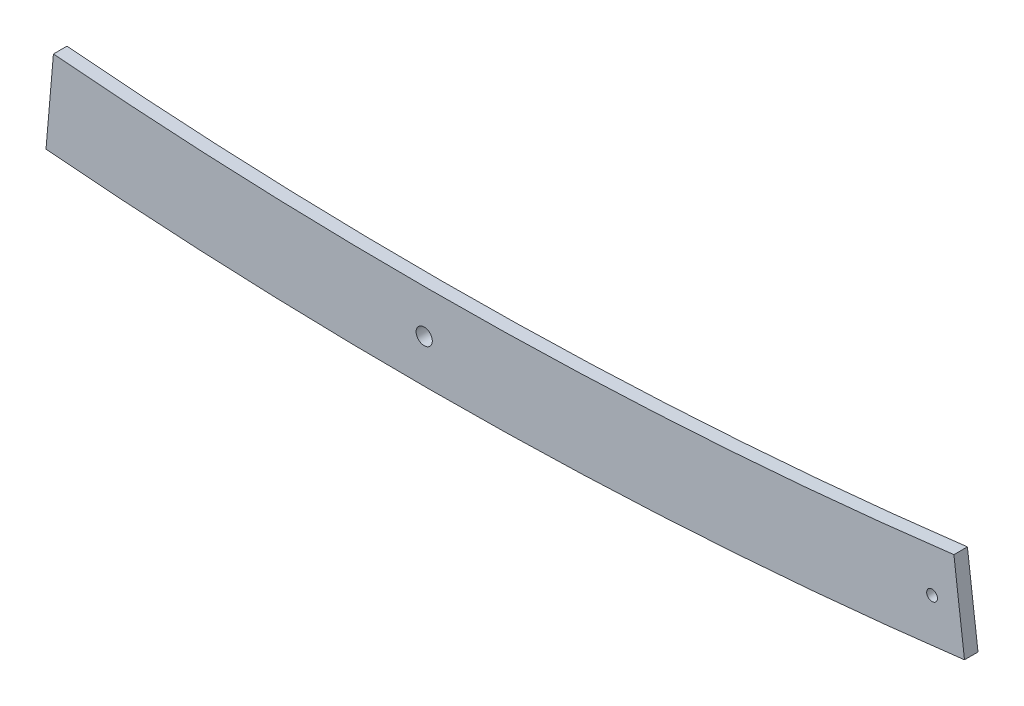
ISO-10303-21;
HEADER;
FILE_DESCRIPTION(('STEP AP214'),'2;1');
FILE_NAME('part.step','',(''),(''),'','','');
FILE_SCHEMA(('AUTOMOTIVE_DESIGN { 1 0 10303 214 1 1 1 1 }'));
ENDSEC;
DATA;
#1=APPLICATION_CONTEXT('core data for automotive mechanical design processes');
#2=APPLICATION_PROTOCOL_DEFINITION('international standard','automotive_design',2000,#1);
#3=PRODUCT_CONTEXT('',#1,'mechanical');
#4=PRODUCT('Part','Part','',(#3));
#5=PRODUCT_RELATED_PRODUCT_CATEGORY('part','',(#4));
#6=PRODUCT_DEFINITION_FORMATION('','',#4);
#7=PRODUCT_DEFINITION_CONTEXT('part definition',#1,'design');
#8=PRODUCT_DEFINITION('design','',#6,#7);
#9=PRODUCT_DEFINITION_SHAPE('','',#8);
#10=(LENGTH_UNIT() NAMED_UNIT(*) SI_UNIT(.MILLI.,.METRE.));
#11=(NAMED_UNIT(*) PLANE_ANGLE_UNIT() SI_UNIT($,.RADIAN.));
#12=(NAMED_UNIT(*) SI_UNIT($,.STERADIAN.) SOLID_ANGLE_UNIT());
#13=UNCERTAINTY_MEASURE_WITH_UNIT(LENGTH_MEASURE(1.E-05),#10,'distance_accuracy_value','');
#14=(GEOMETRIC_REPRESENTATION_CONTEXT(3) GLOBAL_UNCERTAINTY_ASSIGNED_CONTEXT((#13)) GLOBAL_UNIT_ASSIGNED_CONTEXT((#10,
#11,#12)) REPRESENTATION_CONTEXT('',''));
#15=CARTESIAN_POINT('',(0.,0.,0.));
#16=DIRECTION('',(0.,0.,1.));
#17=DIRECTION('',(1.,0.,0.));
#18=AXIS2_PLACEMENT_3D('',#15,#16,#17);
#19=CARTESIAN_POINT('',(0.,816.,1.25));
#20=DIRECTION('',(0.,0.,-1.));
#21=DIRECTION('',(-1.,0.,0.));
#22=AXIS2_PLACEMENT_3D('',#19,#20,#21);
#23=CYLINDRICAL_SURFACE('',#22,816.);
#24=CARTESIAN_POINT('',(0.,816.,-1.25));
#25=DIRECTION('',(0.,0.,1.));
#26=DIRECTION('',(1.,0.,0.));
#27=AXIS2_PLACEMENT_3D('',#24,#25,#26);
#28=CIRCLE('',#27,816.);
#29=CARTESIAN_POINT('',(-70.,3.00799511926323,-1.25));
#30=VERTEX_POINT('',#29);
#31=CARTESIAN_POINT('',(100.,6.15063128999111,-1.25));
#32=VERTEX_POINT('',#31);
#33=EDGE_CURVE('E110',#30,#32,#28,.T.);
#34=ORIENTED_EDGE('',*,*,#33,.T.);
#35=DIRECTION('',(0.,0.,-1.));
#36=VECTOR('',#35,1.);
#37=CARTESIAN_POINT('',(100.,6.15063128999111,1.25));
#38=LINE('',#37,#36);
#39=CARTESIAN_POINT('',(100.,6.15063128999111,1.25));
#40=VERTEX_POINT('',#39);
#41=EDGE_CURVE('E11',#40,#32,#38,.T.);
#42=ORIENTED_EDGE('',*,*,#41,.F.);
#43=CARTESIAN_POINT('',(0.,816.,1.25));
#44=DIRECTION('',(0.,0.,1.));
#45=DIRECTION('',(1.,0.,0.));
#46=AXIS2_PLACEMENT_3D('',#43,#44,#45);
#47=CIRCLE('',#46,816.);
#48=CARTESIAN_POINT('',(-70.,3.00799511926323,1.25));
#49=VERTEX_POINT('',#48);
#50=EDGE_CURVE('E94',#49,#40,#47,.T.);
#51=ORIENTED_EDGE('',*,*,#50,.F.);
#52=DIRECTION('',(0.,0.,-1.));
#53=VECTOR('',#52,1.);
#54=CARTESIAN_POINT('',(-70.,3.00799511926323,1.25));
#55=LINE('',#54,#53);
#56=EDGE_CURVE('E103',#49,#30,#55,.T.);
#57=ORIENTED_EDGE('',*,*,#56,.T.);
#58=EDGE_LOOP('',(#34,#42,#51,#57));
#59=FACE_BOUND('',#58,.T.);
#60=ADVANCED_FACE('F41',(#59),#23,.T.);
#61=CARTESIAN_POINT('',(100.,6.15063128999111,1.25));
#62=DIRECTION('',(-0.992462461654423,-0.122549019607843,0.));
#63=DIRECTION('',(0.122549019607843,-0.992462461654423,0.));
#64=AXIS2_PLACEMENT_3D('',#61,#62,#63);
#65=PLANE('',#64);
#66=DIRECTION('',(-0.122549019607843,0.992462461654423,0.));
#67=VECTOR('',#66,1.);
#68=CARTESIAN_POINT('',(100.,6.15063128999111,-1.25));
#69=LINE('',#68,#67);
#70=CARTESIAN_POINT('',(98.0392156862739,22.0300306764619,-1.25));
#71=VERTEX_POINT('',#70);
#72=EDGE_CURVE('E98',#32,#71,#69,.T.);
#73=ORIENTED_EDGE('',*,*,#72,.T.);
#74=DIRECTION('',(0.,0.,-1.));
#75=VECTOR('',#74,1.);
#76=CARTESIAN_POINT('',(98.0392156862739,22.0300306764619,1.25));
#77=LINE('',#76,#75);
#78=CARTESIAN_POINT('',(98.0392156862739,22.0300306764619,1.25));
#79=VERTEX_POINT('',#78);
#80=EDGE_CURVE('E49',#79,#71,#77,.T.);
#81=ORIENTED_EDGE('',*,*,#80,.F.);
#82=DIRECTION('',(-0.122549019607843,0.992462461654423,0.));
#83=VECTOR('',#82,1.);
#84=CARTESIAN_POINT('',(100.,6.15063128999111,1.25));
#85=LINE('',#84,#83);
#86=EDGE_CURVE('E90',#40,#79,#85,.T.);
#87=ORIENTED_EDGE('',*,*,#86,.F.);
#88=ORIENTED_EDGE('',*,*,#41,.T.);
#89=EDGE_LOOP('',(#73,#81,#87,#88));
#90=FACE_BOUND('',#89,.T.);
#91=ADVANCED_FACE('F100',(#90),#65,.F.);
#92=CARTESIAN_POINT('',(0.,816.,1.25));
#93=DIRECTION('',(0.,0.,-1.));
#94=DIRECTION('',(-1.,0.,0.));
#95=AXIS2_PLACEMENT_3D('',#92,#93,#94);
#96=CYLINDRICAL_SURFACE('',#95,800.);
#97=CARTESIAN_POINT('',(0.,816.,-1.25));
#98=DIRECTION('',(0.,0.,-1.));
#99=DIRECTION('',(1.,0.,0.));
#100=AXIS2_PLACEMENT_3D('',#97,#98,#99);
#101=CIRCLE('',#100,800.);
#102=CARTESIAN_POINT('',(-68.6274509803922,18.9490148228072,-1.25));
#103=VERTEX_POINT('',#102);
#104=EDGE_CURVE('E79',#71,#103,#101,.T.);
#105=ORIENTED_EDGE('',*,*,#104,.T.);
#106=DIRECTION('',(0.,0.,-1.));
#107=VECTOR('',#106,1.);
#108=CARTESIAN_POINT('',(-68.6274509803922,18.9490148228072,1.25));
#109=LINE('',#108,#107);
#110=CARTESIAN_POINT('',(-68.6274509803922,18.9490148228072,1.25));
#111=VERTEX_POINT('',#110);
#112=EDGE_CURVE('E97',#111,#103,#109,.T.);
#113=ORIENTED_EDGE('',*,*,#112,.F.);
#114=CARTESIAN_POINT('',(0.,816.,1.25));
#115=DIRECTION('',(0.,0.,-1.));
#116=DIRECTION('',(1.,0.,0.));
#117=AXIS2_PLACEMENT_3D('',#114,#115,#116);
#118=CIRCLE('',#117,800.);
#119=EDGE_CURVE('E95',#79,#111,#118,.T.);
#120=ORIENTED_EDGE('',*,*,#119,.F.);
#121=ORIENTED_EDGE('',*,*,#80,.T.);
#122=EDGE_LOOP('',(#105,#113,#120,#121));
#123=FACE_BOUND('',#122,.T.);
#124=ADVANCED_FACE('F101',(#123),#96,.F.);
#125=CARTESIAN_POINT('',(-70.,3.00799511926323,1.25));
#126=DIRECTION('',(0.996313731471491,-0.0857843137254907,0.));
#127=DIRECTION('',(0.0857843137254907,0.996313731471491,0.));
#128=AXIS2_PLACEMENT_3D('',#125,#126,#127);
#129=PLANE('',#128);
#130=DIRECTION('',(-0.0857843137254907,-0.996313731471491,0.));
#131=VECTOR('',#130,1.);
#132=CARTESIAN_POINT('',(-70.,3.00799511926323,-1.25));
#133=LINE('',#132,#131);
#134=EDGE_CURVE('E85',#103,#30,#133,.T.);
#135=ORIENTED_EDGE('',*,*,#134,.T.);
#136=ORIENTED_EDGE('',*,*,#56,.F.);
#137=DIRECTION('',(-0.0857843137254907,-0.996313731471491,0.));
#138=VECTOR('',#137,1.);
#139=CARTESIAN_POINT('',(-70.,3.00799511926323,1.25));
#140=LINE('',#139,#138);
#141=EDGE_CURVE('E56',#111,#49,#140,.T.);
#142=ORIENTED_EDGE('',*,*,#141,.F.);
#143=ORIENTED_EDGE('',*,*,#112,.T.);
#144=EDGE_LOOP('',(#135,#136,#142,#143));
#145=FACE_BOUND('',#144,.T.);
#146=ADVANCED_FACE('F155',(#145),#129,.F.);
#147=CARTESIAN_POINT('',(0.,816.,1.25));
#148=DIRECTION('',(0.,0.,1.));
#149=DIRECTION('',(1.,0.,0.));
#150=AXIS2_PLACEMENT_3D('',#147,#148,#149);
#151=PLANE('',#150);
#152=CARTESIAN_POINT('',(94.,13.4869958449823,1.25));
#153=DIRECTION('',(0.,0.,1.));
#154=DIRECTION('',(1.,0.,0.));
#155=AXIS2_PLACEMENT_3D('',#152,#153,#154);
#156=CIRCLE('',#155,0.999999999999998);
#157=CARTESIAN_POINT('',(95.,13.4869958449823,1.25));
#158=VERTEX_POINT('',#157);
#159=EDGE_CURVE('E116',#158,#158,#156,.T.);
#160=ORIENTED_EDGE('',*,*,#159,.F.);
#161=EDGE_LOOP('',(#160));
#162=FACE_BOUND('',#161,.T.);
#163=CARTESIAN_POINT('',(0.,8.,1.25));
#164=DIRECTION('',(0.,0.,1.));
#165=DIRECTION('',(1.,0.,0.));
#166=AXIS2_PLACEMENT_3D('',#163,#164,#165);
#167=CIRCLE('',#166,1.5);
#168=CARTESIAN_POINT('',(1.5,8.,1.25));
#169=VERTEX_POINT('',#168);
#170=EDGE_CURVE('E109',#169,#169,#167,.T.);
#171=ORIENTED_EDGE('',*,*,#170,.F.);
#172=EDGE_LOOP('',(#171));
#173=FACE_BOUND('',#172,.T.);
#174=ORIENTED_EDGE('',*,*,#50,.T.);
#175=ORIENTED_EDGE('',*,*,#86,.T.);
#176=ORIENTED_EDGE('',*,*,#119,.T.);
#177=ORIENTED_EDGE('',*,*,#141,.T.);
#178=EDGE_LOOP('',(#174,#175,#176,#177));
#179=FACE_BOUND('',#178,.T.);
#180=ADVANCED_FACE('F89',(#162,#173,#179),#151,.T.);
#181=CARTESIAN_POINT('',(0.,816.,-1.25));
#182=DIRECTION('',(0.,0.,1.));
#183=DIRECTION('',(1.,0.,0.));
#184=AXIS2_PLACEMENT_3D('',#181,#182,#183);
#185=PLANE('',#184);
#186=CARTESIAN_POINT('',(94.,13.4869958449823,-1.25));
#187=DIRECTION('',(0.,0.,1.));
#188=DIRECTION('',(1.,0.,0.));
#189=AXIS2_PLACEMENT_3D('',#186,#187,#188);
#190=CIRCLE('',#189,0.999999999999998);
#191=CARTESIAN_POINT('',(95.,13.4869958449823,-1.25));
#192=VERTEX_POINT('',#191);
#193=EDGE_CURVE('E42',#192,#192,#190,.T.);
#194=ORIENTED_EDGE('',*,*,#193,.T.);
#195=EDGE_LOOP('',(#194));
#196=FACE_BOUND('',#195,.T.);
#197=CARTESIAN_POINT('',(0.,8.,-1.25));
#198=DIRECTION('',(0.,0.,1.));
#199=DIRECTION('',(1.,0.,0.));
#200=AXIS2_PLACEMENT_3D('',#197,#198,#199);
#201=CIRCLE('',#200,1.5);
#202=CARTESIAN_POINT('',(1.5,8.,-1.25));
#203=VERTEX_POINT('',#202);
#204=EDGE_CURVE('E113',#203,#203,#201,.T.);
#205=ORIENTED_EDGE('',*,*,#204,.T.);
#206=EDGE_LOOP('',(#205));
#207=FACE_BOUND('',#206,.T.);
#208=ORIENTED_EDGE('',*,*,#33,.F.);
#209=ORIENTED_EDGE('',*,*,#134,.F.);
#210=ORIENTED_EDGE('',*,*,#104,.F.);
#211=ORIENTED_EDGE('',*,*,#72,.F.);
#212=EDGE_LOOP('',(#208,#209,#210,#211));
#213=FACE_BOUND('',#212,.T.);
#214=ADVANCED_FACE('F129',(#196,#207,#213),#185,.F.);
#215=CARTESIAN_POINT('',(0.,8.,-10.));
#216=DIRECTION('',(0.,0.,1.));
#217=DIRECTION('',(1.,0.,0.));
#218=AXIS2_PLACEMENT_3D('',#215,#216,#217);
#219=CYLINDRICAL_SURFACE('',#218,1.5);
#220=ORIENTED_EDGE('',*,*,#170,.T.);
#221=EDGE_LOOP('',(#220));
#222=FACE_BOUND('',#221,.T.);
#223=ORIENTED_EDGE('',*,*,#204,.F.);
#224=EDGE_LOOP('',(#223));
#225=FACE_BOUND('',#224,.T.);
#226=ADVANCED_FACE('F135',(#222,#225),#219,.F.);
#227=CARTESIAN_POINT('',(94.,13.4869958449823,-10.));
#228=DIRECTION('',(0.,0.,1.));
#229=DIRECTION('',(1.,0.,0.));
#230=AXIS2_PLACEMENT_3D('',#227,#228,#229);
#231=CYLINDRICAL_SURFACE('',#230,0.999999999999998);
#232=ORIENTED_EDGE('',*,*,#159,.T.);
#233=EDGE_LOOP('',(#232));
#234=FACE_BOUND('',#233,.T.);
#235=ORIENTED_EDGE('',*,*,#193,.F.);
#236=EDGE_LOOP('',(#235));
#237=FACE_BOUND('',#236,.T.);
#238=ADVANCED_FACE('F134',(#234,#237),#231,.F.);
#239=CLOSED_SHELL('',(#60,#91,#124,#146,#180,#214,#226,#238));
#240=MANIFOLD_SOLID_BREP('B2',#239);
#241=ADVANCED_BREP_SHAPE_REPRESENTATION('',(#18,#240),#14);
#242=SHAPE_DEFINITION_REPRESENTATION(#9,#241);
ENDSEC;
END-ISO-10303-21;
